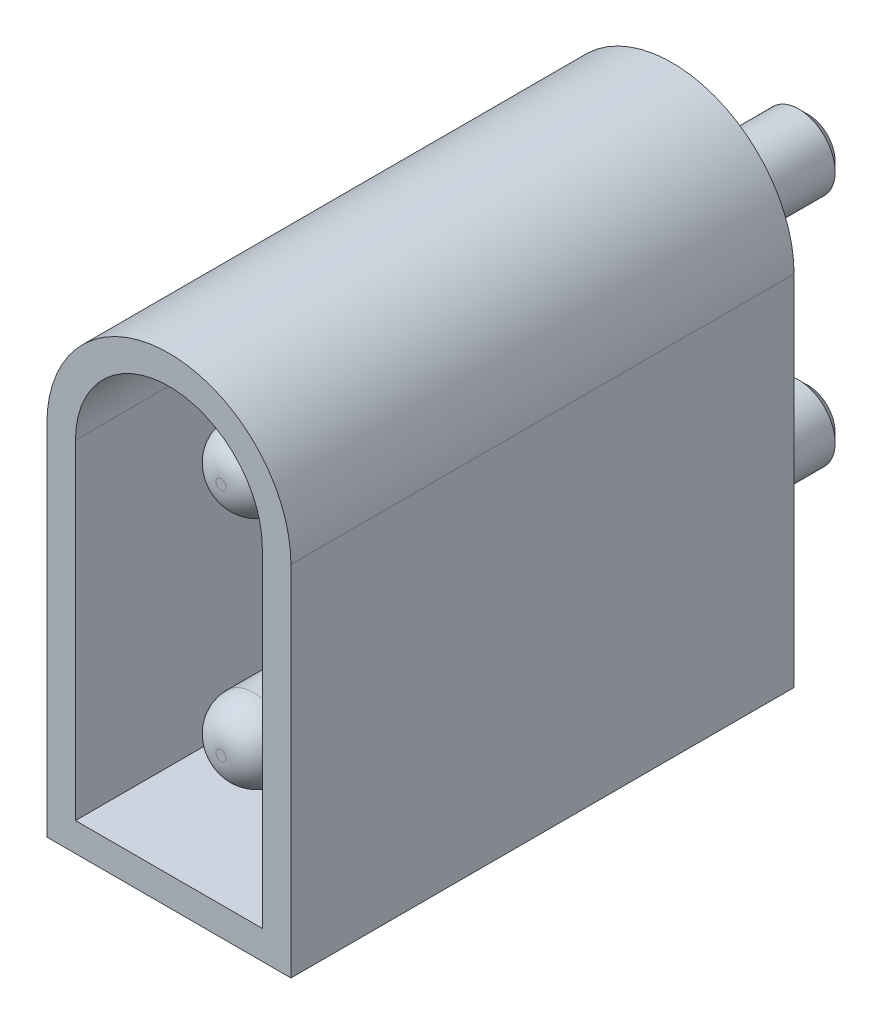
ISO-10303-21;
HEADER;
FILE_DESCRIPTION(('STEP AP214'),'2;1');
FILE_NAME('part.step','',(''),(''),'','','');
FILE_SCHEMA(('AUTOMOTIVE_DESIGN { 1 0 10303 214 1 1 1 1 }'));
ENDSEC;
DATA;
#1=APPLICATION_CONTEXT('core data for automotive mechanical design processes');
#2=APPLICATION_PROTOCOL_DEFINITION('international standard','automotive_design',2000,#1);
#3=PRODUCT_CONTEXT('',#1,'mechanical');
#4=PRODUCT('Part','Part','',(#3));
#5=PRODUCT_RELATED_PRODUCT_CATEGORY('part','',(#4));
#6=PRODUCT_DEFINITION_FORMATION('','',#4);
#7=PRODUCT_DEFINITION_CONTEXT('part definition',#1,'design');
#8=PRODUCT_DEFINITION('design','',#6,#7);
#9=PRODUCT_DEFINITION_SHAPE('','',#8);
#10=(LENGTH_UNIT() NAMED_UNIT(*) SI_UNIT(.MILLI.,.METRE.));
#11=(NAMED_UNIT(*) PLANE_ANGLE_UNIT() SI_UNIT($,.RADIAN.));
#12=(NAMED_UNIT(*) SI_UNIT($,.STERADIAN.) SOLID_ANGLE_UNIT());
#13=UNCERTAINTY_MEASURE_WITH_UNIT(LENGTH_MEASURE(1.E-05),#10,'distance_accuracy_value','');
#14=(GEOMETRIC_REPRESENTATION_CONTEXT(3) GLOBAL_UNCERTAINTY_ASSIGNED_CONTEXT((#13)) GLOBAL_UNIT_ASSIGNED_CONTEXT((#10,
#11,#12)) REPRESENTATION_CONTEXT('',''));
#15=CARTESIAN_POINT('',(0.,0.,0.));
#16=DIRECTION('',(0.,0.,1.));
#17=DIRECTION('',(1.,0.,0.));
#18=AXIS2_PLACEMENT_3D('',#15,#16,#17);
#19=CARTESIAN_POINT('',(0.,7.63,10.72));
#20=DIRECTION('',(0.,0.,-1.));
#21=DIRECTION('',(-1.,0.,0.));
#22=AXIS2_PLACEMENT_3D('',#19,#20,#21);
#23=PLANE('',#22);
#24=CARTESIAN_POINT('',(0.,7.63,10.72));
#25=DIRECTION('',(0.,0.,1.));
#26=DIRECTION('',(-1.,0.,0.));
#27=AXIS2_PLACEMENT_3D('',#24,#25,#26);
#28=CIRCLE('',#27,2.6);
#29=CARTESIAN_POINT('',(2.6,7.63,10.72));
#30=VERTEX_POINT('',#29);
#31=CARTESIAN_POINT('',(-2.6,7.63,10.72));
#32=VERTEX_POINT('',#31);
#33=EDGE_CURVE('E170',#30,#32,#28,.T.);
#34=ORIENTED_EDGE('',*,*,#33,.T.);
#35=DIRECTION('',(0.,-1.,0.));
#36=VECTOR('',#35,1.);
#37=CARTESIAN_POINT('',(-2.6,7.63,10.72));
#38=LINE('',#37,#36);
#39=CARTESIAN_POINT('',(-2.6,0.,10.72));
#40=VERTEX_POINT('',#39);
#41=EDGE_CURVE('E95',#32,#40,#38,.T.);
#42=ORIENTED_EDGE('',*,*,#41,.T.);
#43=DIRECTION('',(1.,0.,0.));
#44=VECTOR('',#43,1.);
#45=CARTESIAN_POINT('',(-2.6,0.,10.72));
#46=LINE('',#45,#44);
#47=CARTESIAN_POINT('',(2.6,0.,10.72));
#48=VERTEX_POINT('',#47);
#49=EDGE_CURVE('E173',#40,#48,#46,.T.);
#50=ORIENTED_EDGE('',*,*,#49,.T.);
#51=DIRECTION('',(0.,1.,0.));
#52=VECTOR('',#51,1.);
#53=CARTESIAN_POINT('',(2.6,0.,10.72));
#54=LINE('',#53,#52);
#55=EDGE_CURVE('E66',#48,#30,#54,.T.);
#56=ORIENTED_EDGE('',*,*,#55,.T.);
#57=EDGE_LOOP('',(#34,#42,#50,#56));
#58=FACE_BOUND('',#57,.T.);
#59=CARTESIAN_POINT('',(0.,7.63,10.72));
#60=DIRECTION('',(0.,0.,-1.));
#61=DIRECTION('',(-1.,0.,0.));
#62=AXIS2_PLACEMENT_3D('',#59,#60,#61);
#63=CIRCLE('',#62,1.99);
#64=CARTESIAN_POINT('',(1.99,7.63,10.72));
#65=VERTEX_POINT('',#64);
#66=CARTESIAN_POINT('',(-1.99,7.63,10.72));
#67=VERTEX_POINT('',#66);
#68=EDGE_CURVE('E140',#65,#67,#63,.F.);
#69=ORIENTED_EDGE('',*,*,#68,.F.);
#70=DIRECTION('',(0.,1.,0.));
#71=VECTOR('',#70,1.);
#72=CARTESIAN_POINT('',(1.99,7.63,10.72));
#73=LINE('',#72,#71);
#74=CARTESIAN_POINT('',(1.99,0.61,10.72));
#75=VERTEX_POINT('',#74);
#76=EDGE_CURVE('E155',#75,#65,#73,.T.);
#77=ORIENTED_EDGE('',*,*,#76,.F.);
#78=DIRECTION('',(1.,0.,0.));
#79=VECTOR('',#78,1.);
#80=CARTESIAN_POINT('',(0.,0.61,10.72));
#81=LINE('',#80,#79);
#82=CARTESIAN_POINT('',(-1.99,0.61,10.72));
#83=VERTEX_POINT('',#82);
#84=EDGE_CURVE('E153',#83,#75,#81,.T.);
#85=ORIENTED_EDGE('',*,*,#84,.F.);
#86=DIRECTION('',(0.,-1.,0.));
#87=VECTOR('',#86,1.);
#88=CARTESIAN_POINT('',(-1.99,7.63,10.72));
#89=LINE('',#88,#87);
#90=EDGE_CURVE('E132',#67,#83,#89,.T.);
#91=ORIENTED_EDGE('',*,*,#90,.F.);
#92=EDGE_LOOP('',(#69,#77,#85,#91));
#93=FACE_BOUND('',#92,.T.);
#94=ADVANCED_FACE('F41',(#58,#93),#23,.F.);
#95=CARTESIAN_POINT('',(0.,7.63,10.72));
#96=DIRECTION('',(0.,0.,-1.));
#97=DIRECTION('',(-1.,0.,0.));
#98=AXIS2_PLACEMENT_3D('',#95,#96,#97);
#99=CYLINDRICAL_SURFACE('',#98,2.6);
#100=CARTESIAN_POINT('',(0.,7.63,0.));
#101=DIRECTION('',(0.,0.,1.));
#102=DIRECTION('',(-1.,0.,0.));
#103=AXIS2_PLACEMENT_3D('',#100,#101,#102);
#104=CIRCLE('',#103,2.6);
#105=CARTESIAN_POINT('',(2.6,7.63,0.));
#106=VERTEX_POINT('',#105);
#107=CARTESIAN_POINT('',(-2.6,7.63,0.));
#108=VERTEX_POINT('',#107);
#109=EDGE_CURVE('E169',#106,#108,#104,.T.);
#110=ORIENTED_EDGE('',*,*,#109,.T.);
#111=DIRECTION('',(0.,0.,-1.));
#112=VECTOR('',#111,1.);
#113=CARTESIAN_POINT('',(-2.6,7.63,10.72));
#114=LINE('',#113,#112);
#115=EDGE_CURVE('E190',#32,#108,#114,.T.);
#116=ORIENTED_EDGE('',*,*,#115,.F.);
#117=ORIENTED_EDGE('',*,*,#33,.F.);
#118=DIRECTION('',(0.,0.,-1.));
#119=VECTOR('',#118,1.);
#120=CARTESIAN_POINT('',(2.6,7.63,10.72));
#121=LINE('',#120,#119);
#122=EDGE_CURVE('E176',#30,#106,#121,.T.);
#123=ORIENTED_EDGE('',*,*,#122,.T.);
#124=EDGE_LOOP('',(#110,#116,#117,#123));
#125=FACE_BOUND('',#124,.T.);
#126=ADVANCED_FACE('F231',(#125),#99,.T.);
#127=CARTESIAN_POINT('',(-2.6,7.63,10.72));
#128=DIRECTION('',(1.,0.,0.));
#129=DIRECTION('',(0.,1.,0.));
#130=AXIS2_PLACEMENT_3D('',#127,#128,#129);
#131=PLANE('',#130);
#132=DIRECTION('',(0.,-1.,0.));
#133=VECTOR('',#132,1.);
#134=CARTESIAN_POINT('',(-2.6,7.63,0.));
#135=LINE('',#134,#133);
#136=CARTESIAN_POINT('',(-2.6,0.,0.));
#137=VERTEX_POINT('',#136);
#138=EDGE_CURVE('E179',#108,#137,#135,.T.);
#139=ORIENTED_EDGE('',*,*,#138,.T.);
#140=DIRECTION('',(0.,0.,-1.));
#141=VECTOR('',#140,1.);
#142=CARTESIAN_POINT('',(-2.6,0.,10.72));
#143=LINE('',#142,#141);
#144=EDGE_CURVE('E187',#40,#137,#143,.T.);
#145=ORIENTED_EDGE('',*,*,#144,.F.);
#146=ORIENTED_EDGE('',*,*,#41,.F.);
#147=ORIENTED_EDGE('',*,*,#115,.T.);
#148=EDGE_LOOP('',(#139,#145,#146,#147));
#149=FACE_BOUND('',#148,.T.);
#150=ADVANCED_FACE('F236',(#149),#131,.F.);
#151=CARTESIAN_POINT('',(-2.6,0.,10.72));
#152=DIRECTION('',(0.,1.,0.));
#153=DIRECTION('',(0.,0.,1.));
#154=AXIS2_PLACEMENT_3D('',#151,#152,#153);
#155=PLANE('',#154);
#156=DIRECTION('',(1.,0.,0.));
#157=VECTOR('',#156,1.);
#158=CARTESIAN_POINT('',(-2.6,0.,0.));
#159=LINE('',#158,#157);
#160=CARTESIAN_POINT('',(2.6,0.,0.));
#161=VERTEX_POINT('',#160);
#162=EDGE_CURVE('E181',#137,#161,#159,.T.);
#163=ORIENTED_EDGE('',*,*,#162,.T.);
#164=DIRECTION('',(0.,0.,-1.));
#165=VECTOR('',#164,1.);
#166=CARTESIAN_POINT('',(2.6,0.,10.72));
#167=LINE('',#166,#165);
#168=EDGE_CURVE('E185',#48,#161,#167,.T.);
#169=ORIENTED_EDGE('',*,*,#168,.F.);
#170=ORIENTED_EDGE('',*,*,#49,.F.);
#171=ORIENTED_EDGE('',*,*,#144,.T.);
#172=EDGE_LOOP('',(#163,#169,#170,#171));
#173=FACE_BOUND('',#172,.T.);
#174=ADVANCED_FACE('F251',(#173),#155,.F.);
#175=CARTESIAN_POINT('',(2.6,0.,10.72));
#176=DIRECTION('',(-1.,0.,0.));
#177=DIRECTION('',(0.,-1.,0.));
#178=AXIS2_PLACEMENT_3D('',#175,#176,#177);
#179=PLANE('',#178);
#180=DIRECTION('',(0.,1.,0.));
#181=VECTOR('',#180,1.);
#182=CARTESIAN_POINT('',(2.6,0.,0.));
#183=LINE('',#182,#181);
#184=EDGE_CURVE('E87',#161,#106,#183,.T.);
#185=ORIENTED_EDGE('',*,*,#184,.T.);
#186=ORIENTED_EDGE('',*,*,#122,.F.);
#187=ORIENTED_EDGE('',*,*,#55,.F.);
#188=ORIENTED_EDGE('',*,*,#168,.T.);
#189=EDGE_LOOP('',(#185,#186,#187,#188));
#190=FACE_BOUND('',#189,.T.);
#191=ADVANCED_FACE('F247',(#190),#179,.F.);
#192=CARTESIAN_POINT('',(0.,7.63,0.));
#193=DIRECTION('',(0.,0.,-1.));
#194=DIRECTION('',(-1.,0.,0.));
#195=AXIS2_PLACEMENT_3D('',#192,#193,#194);
#196=PLANE('',#195);
#197=CARTESIAN_POINT('',(0.,2.25,0.));
#198=DIRECTION('',(0.,0.,-1.));
#199=DIRECTION('',(-1.,0.,0.));
#200=AXIS2_PLACEMENT_3D('',#197,#198,#199);
#201=CIRCLE('',#200,0.775);
#202=CARTESIAN_POINT('',(-0.775,2.25,0.));
#203=VERTEX_POINT('',#202);
#204=EDGE_CURVE('E163',#203,#203,#201,.T.);
#205=ORIENTED_EDGE('',*,*,#204,.F.);
#206=EDGE_LOOP('',(#205));
#207=FACE_BOUND('',#206,.T.);
#208=CARTESIAN_POINT('',(0.,7.25,0.));
#209=DIRECTION('',(0.,0.,-1.));
#210=DIRECTION('',(-1.,0.,0.));
#211=AXIS2_PLACEMENT_3D('',#208,#209,#210);
#212=CIRCLE('',#211,0.775);
#213=CARTESIAN_POINT('',(-0.775,7.25,0.));
#214=VERTEX_POINT('',#213);
#215=EDGE_CURVE('E166',#214,#214,#212,.T.);
#216=ORIENTED_EDGE('',*,*,#215,.F.);
#217=EDGE_LOOP('',(#216));
#218=FACE_BOUND('',#217,.T.);
#219=ORIENTED_EDGE('',*,*,#109,.F.);
#220=ORIENTED_EDGE('',*,*,#184,.F.);
#221=ORIENTED_EDGE('',*,*,#162,.F.);
#222=ORIENTED_EDGE('',*,*,#138,.F.);
#223=EDGE_LOOP('',(#219,#220,#221,#222));
#224=FACE_BOUND('',#223,.T.);
#225=ADVANCED_FACE('F244',(#207,#218,#224),#196,.T.);
#226=CARTESIAN_POINT('',(0.,7.25,-2.9));
#227=DIRECTION('',(0.,0.,1.));
#228=DIRECTION('',(1.,0.,0.));
#229=AXIS2_PLACEMENT_3D('',#226,#227,#228);
#230=CYLINDRICAL_SURFACE('',#229,0.775);
#231=CARTESIAN_POINT('',(0.,7.25,-2.7));
#232=DIRECTION('',(0.,0.,-1.));
#233=DIRECTION('',(-1.,0.,0.));
#234=AXIS2_PLACEMENT_3D('',#231,#232,#233);
#235=CIRCLE('',#234,0.775);
#236=CARTESIAN_POINT('',(-0.775,7.25,-2.7));
#237=VERTEX_POINT('',#236);
#238=EDGE_CURVE('E201',#237,#237,#235,.F.);
#239=ORIENTED_EDGE('',*,*,#238,.T.);
#240=EDGE_LOOP('',(#239));
#241=FACE_BOUND('',#240,.T.);
#242=ORIENTED_EDGE('',*,*,#215,.T.);
#243=EDGE_LOOP('',(#242));
#244=FACE_BOUND('',#243,.T.);
#245=ADVANCED_FACE('F242',(#241,#244),#230,.T.);
#246=CARTESIAN_POINT('',(0.,7.25,-2.9));
#247=DIRECTION('',(0.,0.,-1.));
#248=DIRECTION('',(-1.,0.,0.));
#249=AXIS2_PLACEMENT_3D('',#246,#247,#248);
#250=PLANE('',#249);
#251=CARTESIAN_POINT('',(0.,7.25,-2.9));
#252=DIRECTION('',(0.,0.,-1.));
#253=DIRECTION('',(-1.,0.,0.));
#254=AXIS2_PLACEMENT_3D('',#251,#252,#253);
#255=CIRCLE('',#254,0.575000000000001);
#256=CARTESIAN_POINT('',(-0.575000000000001,7.25,-2.9));
#257=VERTEX_POINT('',#256);
#258=EDGE_CURVE('E198',#257,#257,#255,.T.);
#259=ORIENTED_EDGE('',*,*,#258,.T.);
#260=EDGE_LOOP('',(#259));
#261=FACE_BOUND('',#260,.T.);
#262=ADVANCED_FACE('F281',(#261),#250,.T.);
#263=CARTESIAN_POINT('',(0.,2.25,-2.9));
#264=DIRECTION('',(0.,0.,1.));
#265=DIRECTION('',(1.,0.,0.));
#266=AXIS2_PLACEMENT_3D('',#263,#264,#265);
#267=CYLINDRICAL_SURFACE('',#266,0.775);
#268=CARTESIAN_POINT('',(0.,2.25,-2.7));
#269=DIRECTION('',(0.,0.,-1.));
#270=DIRECTION('',(-1.,0.,0.));
#271=AXIS2_PLACEMENT_3D('',#268,#269,#270);
#272=CIRCLE('',#271,0.775);
#273=CARTESIAN_POINT('',(-0.775,2.25,-2.7));
#274=VERTEX_POINT('',#273);
#275=EDGE_CURVE('E195',#274,#274,#272,.F.);
#276=ORIENTED_EDGE('',*,*,#275,.T.);
#277=EDGE_LOOP('',(#276));
#278=FACE_BOUND('',#277,.T.);
#279=ORIENTED_EDGE('',*,*,#204,.T.);
#280=EDGE_LOOP('',(#279));
#281=FACE_BOUND('',#280,.T.);
#282=ADVANCED_FACE('F283',(#278,#281),#267,.T.);
#283=CARTESIAN_POINT('',(0.,2.25,-2.9));
#284=DIRECTION('',(0.,0.,-1.));
#285=DIRECTION('',(-1.,0.,0.));
#286=AXIS2_PLACEMENT_3D('',#283,#284,#285);
#287=PLANE('',#286);
#288=CARTESIAN_POINT('',(0.,2.25,-2.9));
#289=DIRECTION('',(0.,0.,-1.));
#290=DIRECTION('',(-1.,0.,0.));
#291=AXIS2_PLACEMENT_3D('',#288,#289,#290);
#292=CIRCLE('',#291,0.575000000000001);
#293=CARTESIAN_POINT('',(-0.575000000000001,2.25,-2.9));
#294=VERTEX_POINT('',#293);
#295=EDGE_CURVE('E192',#294,#294,#292,.T.);
#296=ORIENTED_EDGE('',*,*,#295,.T.);
#297=EDGE_LOOP('',(#296));
#298=FACE_BOUND('',#297,.T.);
#299=ADVANCED_FACE('F265',(#298),#287,.T.);
#300=CARTESIAN_POINT('',(0.,2.25,-2.9));
#301=DIRECTION('',(0.,0.,1.));
#302=DIRECTION('',(1.,0.,0.));
#303=AXIS2_PLACEMENT_3D('',#300,#301,#302);
#304=CONICAL_SURFACE('',#303,0.575000000000001,0.785398163397443);
#305=ORIENTED_EDGE('',*,*,#275,.F.);
#306=EDGE_LOOP('',(#305));
#307=FACE_BOUND('',#306,.T.);
#308=ORIENTED_EDGE('',*,*,#295,.F.);
#309=EDGE_LOOP('',(#308));
#310=FACE_BOUND('',#309,.T.);
#311=ADVANCED_FACE('F258',(#307,#310),#304,.T.);
#312=CARTESIAN_POINT('',(0.,7.25,-2.9));
#313=DIRECTION('',(0.,0.,1.));
#314=DIRECTION('',(1.,0.,0.));
#315=AXIS2_PLACEMENT_3D('',#312,#313,#314);
#316=CONICAL_SURFACE('',#315,0.575000000000001,0.785398163397442);
#317=ORIENTED_EDGE('',*,*,#238,.F.);
#318=EDGE_LOOP('',(#317));
#319=FACE_BOUND('',#318,.T.);
#320=ORIENTED_EDGE('',*,*,#258,.F.);
#321=EDGE_LOOP('',(#320));
#322=FACE_BOUND('',#321,.T.);
#323=ADVANCED_FACE('F264',(#319,#322),#316,.T.);
#324=CARTESIAN_POINT('',(0.,7.63,10.72));
#325=DIRECTION('',(0.,0.,-1.));
#326=DIRECTION('',(-1.,0.,0.));
#327=AXIS2_PLACEMENT_3D('',#324,#325,#326);
#328=CYLINDRICAL_SURFACE('',#327,1.99);
#329=CARTESIAN_POINT('',(0.,7.63,0.609999999999999));
#330=DIRECTION('',(0.,0.,-1.));
#331=DIRECTION('',(-1.,0.,0.));
#332=AXIS2_PLACEMENT_3D('',#329,#330,#331);
#333=CIRCLE('',#332,1.99);
#334=CARTESIAN_POINT('',(1.99,7.63,0.609999999999999));
#335=VERTEX_POINT('',#334);
#336=CARTESIAN_POINT('',(-1.99,7.63,0.609999999999999));
#337=VERTEX_POINT('',#336);
#338=EDGE_CURVE('E123',#335,#337,#333,.F.);
#339=ORIENTED_EDGE('',*,*,#338,.F.);
#340=DIRECTION('',(0.,0.,-1.));
#341=VECTOR('',#340,1.);
#342=CARTESIAN_POINT('',(1.99,7.63,10.72));
#343=LINE('',#342,#341);
#344=EDGE_CURVE('E143',#65,#335,#343,.T.);
#345=ORIENTED_EDGE('',*,*,#344,.F.);
#346=ORIENTED_EDGE('',*,*,#68,.T.);
#347=DIRECTION('',(0.,0.,1.));
#348=VECTOR('',#347,1.);
#349=CARTESIAN_POINT('',(-1.99,7.63,10.72));
#350=LINE('',#349,#348);
#351=EDGE_CURVE('E135',#67,#337,#350,.F.);
#352=ORIENTED_EDGE('',*,*,#351,.T.);
#353=EDGE_LOOP('',(#339,#345,#346,#352));
#354=FACE_BOUND('',#353,.T.);
#355=ADVANCED_FACE('F270',(#354),#328,.F.);
#356=CARTESIAN_POINT('',(-1.99,7.63,10.72));
#357=DIRECTION('',(1.,0.,0.));
#358=DIRECTION('',(0.,1.,0.));
#359=AXIS2_PLACEMENT_3D('',#356,#357,#358);
#360=PLANE('',#359);
#361=DIRECTION('',(0.,-1.,0.));
#362=VECTOR('',#361,1.);
#363=CARTESIAN_POINT('',(-1.99,7.63,0.61));
#364=LINE('',#363,#362);
#365=CARTESIAN_POINT('',(-1.99,0.61,0.61));
#366=VERTEX_POINT('',#365);
#367=EDGE_CURVE('E117',#337,#366,#364,.T.);
#368=ORIENTED_EDGE('',*,*,#367,.F.);
#369=ORIENTED_EDGE('',*,*,#351,.F.);
#370=ORIENTED_EDGE('',*,*,#90,.T.);
#371=DIRECTION('',(0.,0.,-1.));
#372=VECTOR('',#371,1.);
#373=CARTESIAN_POINT('',(-1.99,0.61,10.72));
#374=LINE('',#373,#372);
#375=EDGE_CURVE('E129',#83,#366,#374,.T.);
#376=ORIENTED_EDGE('',*,*,#375,.T.);
#377=EDGE_LOOP('',(#368,#369,#370,#376));
#378=FACE_BOUND('',#377,.T.);
#379=ADVANCED_FACE('F130',(#378),#360,.T.);
#380=CARTESIAN_POINT('',(-2.6,0.61,10.72));
#381=DIRECTION('',(0.,1.,0.));
#382=DIRECTION('',(0.,0.,1.));
#383=AXIS2_PLACEMENT_3D('',#380,#381,#382);
#384=PLANE('',#383);
#385=DIRECTION('',(1.,0.,0.));
#386=VECTOR('',#385,1.);
#387=CARTESIAN_POINT('',(0.,0.61,0.61));
#388=LINE('',#387,#386);
#389=CARTESIAN_POINT('',(1.99,0.61,0.61));
#390=VERTEX_POINT('',#389);
#391=EDGE_CURVE('E121',#366,#390,#388,.T.);
#392=ORIENTED_EDGE('',*,*,#391,.F.);
#393=ORIENTED_EDGE('',*,*,#375,.F.);
#394=ORIENTED_EDGE('',*,*,#84,.T.);
#395=DIRECTION('',(0.,0.,-1.));
#396=VECTOR('',#395,1.);
#397=CARTESIAN_POINT('',(1.99,0.61,10.72));
#398=LINE('',#397,#396);
#399=EDGE_CURVE('E57',#75,#390,#398,.T.);
#400=ORIENTED_EDGE('',*,*,#399,.T.);
#401=EDGE_LOOP('',(#392,#393,#394,#400));
#402=FACE_BOUND('',#401,.T.);
#403=ADVANCED_FACE('F137',(#402),#384,.T.);
#404=CARTESIAN_POINT('',(1.99,0.,10.72));
#405=DIRECTION('',(-1.,0.,0.));
#406=DIRECTION('',(0.,-1.,0.));
#407=AXIS2_PLACEMENT_3D('',#404,#405,#406);
#408=PLANE('',#407);
#409=DIRECTION('',(0.,1.,0.));
#410=VECTOR('',#409,1.);
#411=CARTESIAN_POINT('',(1.99,7.63,0.61));
#412=LINE('',#411,#410);
#413=EDGE_CURVE('E138',#390,#335,#412,.T.);
#414=ORIENTED_EDGE('',*,*,#413,.F.);
#415=ORIENTED_EDGE('',*,*,#399,.F.);
#416=ORIENTED_EDGE('',*,*,#76,.T.);
#417=ORIENTED_EDGE('',*,*,#344,.T.);
#418=EDGE_LOOP('',(#414,#415,#416,#417));
#419=FACE_BOUND('',#418,.T.);
#420=ADVANCED_FACE('F319',(#419),#408,.T.);
#421=CARTESIAN_POINT('',(0.,7.63,0.61));
#422=DIRECTION('',(0.,0.,-1.));
#423=DIRECTION('',(-1.,0.,0.));
#424=AXIS2_PLACEMENT_3D('',#421,#422,#423);
#425=PLANE('',#424);
#426=CARTESIAN_POINT('',(0.,7.25,0.609999999999999));
#427=DIRECTION('',(0.,0.,-1.));
#428=DIRECTION('',(-1.,0.,0.));
#429=AXIS2_PLACEMENT_3D('',#426,#427,#428);
#430=CIRCLE('',#429,0.81);
#431=CARTESIAN_POINT('',(-0.81,7.25,0.609999999999999));
#432=VERTEX_POINT('',#431);
#433=EDGE_CURVE('E207',#432,#432,#430,.F.);
#434=ORIENTED_EDGE('',*,*,#433,.F.);
#435=EDGE_LOOP('',(#434));
#436=FACE_BOUND('',#435,.T.);
#437=CARTESIAN_POINT('',(0.,2.25,0.609999999999999));
#438=DIRECTION('',(0.,0.,-1.));
#439=DIRECTION('',(-1.,0.,0.));
#440=AXIS2_PLACEMENT_3D('',#437,#438,#439);
#441=CIRCLE('',#440,0.81);
#442=CARTESIAN_POINT('',(-0.81,2.25,0.609999999999999));
#443=VERTEX_POINT('',#442);
#444=EDGE_CURVE('E204',#443,#443,#441,.F.);
#445=ORIENTED_EDGE('',*,*,#444,.F.);
#446=EDGE_LOOP('',(#445));
#447=FACE_BOUND('',#446,.T.);
#448=ORIENTED_EDGE('',*,*,#338,.T.);
#449=ORIENTED_EDGE('',*,*,#367,.T.);
#450=ORIENTED_EDGE('',*,*,#391,.T.);
#451=ORIENTED_EDGE('',*,*,#413,.T.);
#452=EDGE_LOOP('',(#448,#449,#450,#451));
#453=FACE_BOUND('',#452,.T.);
#454=ADVANCED_FACE('F119',(#436,#447,#453),#425,.F.);
#455=CARTESIAN_POINT('',(0.,2.25,9.61));
#456=DIRECTION('',(0.,0.,-1.));
#457=DIRECTION('',(-1.,0.,0.));
#458=AXIS2_PLACEMENT_3D('',#455,#456,#457);
#459=CYLINDRICAL_SURFACE('',#458,0.81);
#460=CARTESIAN_POINT('',(0.,2.25,8.91));
#461=DIRECTION('',(0.,0.,1.));
#462=DIRECTION('',(1.,0.,0.));
#463=AXIS2_PLACEMENT_3D('',#460,#461,#462);
#464=CIRCLE('',#463,0.81);
#465=CARTESIAN_POINT('',(0.81,2.25,8.91));
#466=VERTEX_POINT('',#465);
#467=EDGE_CURVE('E11',#466,#466,#464,.F.);
#468=ORIENTED_EDGE('',*,*,#467,.T.);
#469=EDGE_LOOP('',(#468));
#470=FACE_BOUND('',#469,.T.);
#471=ORIENTED_EDGE('',*,*,#444,.T.);
#472=EDGE_LOOP('',(#471));
#473=FACE_BOUND('',#472,.T.);
#474=ADVANCED_FACE('F318',(#470,#473),#459,.T.);
#475=CARTESIAN_POINT('',(0.,2.25,9.61));
#476=DIRECTION('',(0.,0.,1.));
#477=DIRECTION('',(1.,0.,0.));
#478=AXIS2_PLACEMENT_3D('',#475,#476,#477);
#479=PLANE('',#478);
#480=CARTESIAN_POINT('',(0.,2.25,9.61));
#481=DIRECTION('',(0.,0.,1.));
#482=DIRECTION('',(1.,0.,0.));
#483=AXIS2_PLACEMENT_3D('',#480,#481,#482);
#484=CIRCLE('',#483,0.11);
#485=CARTESIAN_POINT('',(0.11,2.25,9.61));
#486=VERTEX_POINT('',#485);
#487=EDGE_CURVE('E50',#486,#486,#484,.T.);
#488=ORIENTED_EDGE('',*,*,#487,.T.);
#489=EDGE_LOOP('',(#488));
#490=FACE_BOUND('',#489,.T.);
#491=ADVANCED_FACE('F218',(#490),#479,.T.);
#492=CARTESIAN_POINT('',(0.,7.25,9.61));
#493=DIRECTION('',(0.,0.,-1.));
#494=DIRECTION('',(-1.,0.,0.));
#495=AXIS2_PLACEMENT_3D('',#492,#493,#494);
#496=CYLINDRICAL_SURFACE('',#495,0.81);
#497=CARTESIAN_POINT('',(0.,7.25,8.91));
#498=DIRECTION('',(0.,0.,1.));
#499=DIRECTION('',(1.,0.,0.));
#500=AXIS2_PLACEMENT_3D('',#497,#498,#499);
#501=CIRCLE('',#500,0.81);
#502=CARTESIAN_POINT('',(0.81,7.25,8.91));
#503=VERTEX_POINT('',#502);
#504=EDGE_CURVE('E213',#503,#503,#501,.F.);
#505=ORIENTED_EDGE('',*,*,#504,.T.);
#506=EDGE_LOOP('',(#505));
#507=FACE_BOUND('',#506,.T.);
#508=ORIENTED_EDGE('',*,*,#433,.T.);
#509=EDGE_LOOP('',(#508));
#510=FACE_BOUND('',#509,.T.);
#511=ADVANCED_FACE('F335',(#507,#510),#496,.T.);
#512=CARTESIAN_POINT('',(0.,7.25,9.61));
#513=DIRECTION('',(0.,0.,1.));
#514=DIRECTION('',(1.,0.,0.));
#515=AXIS2_PLACEMENT_3D('',#512,#513,#514);
#516=PLANE('',#515);
#517=CARTESIAN_POINT('',(0.,7.25,9.61));
#518=DIRECTION('',(0.,0.,1.));
#519=DIRECTION('',(1.,0.,0.));
#520=AXIS2_PLACEMENT_3D('',#517,#518,#519);
#521=CIRCLE('',#520,0.11);
#522=CARTESIAN_POINT('',(0.11,7.25,9.61));
#523=VERTEX_POINT('',#522);
#524=EDGE_CURVE('E210',#523,#523,#521,.T.);
#525=ORIENTED_EDGE('',*,*,#524,.T.);
#526=EDGE_LOOP('',(#525));
#527=FACE_BOUND('',#526,.T.);
#528=ADVANCED_FACE('F227',(#527),#516,.T.);
#529=CARTESIAN_POINT('',(0.,7.25,8.91));
#530=DIRECTION('',(0.,0.,1.));
#531=DIRECTION('',(1.,0.,0.));
#532=AXIS2_PLACEMENT_3D('',#529,#530,#531);
#533=DEGENERATE_TOROIDAL_SURFACE('',#532,0.11,0.7,.T.);
#534=ORIENTED_EDGE('',*,*,#504,.F.);
#535=EDGE_LOOP('',(#534));
#536=FACE_BOUND('',#535,.T.);
#537=ORIENTED_EDGE('',*,*,#524,.F.);
#538=EDGE_LOOP('',(#537));
#539=FACE_BOUND('',#538,.T.);
#540=ADVANCED_FACE('F221',(#536,#539),#533,.T.);
#541=CARTESIAN_POINT('',(0.,2.25,8.91));
#542=DIRECTION('',(0.,0.,1.));
#543=DIRECTION('',(1.,0.,0.));
#544=AXIS2_PLACEMENT_3D('',#541,#542,#543);
#545=DEGENERATE_TOROIDAL_SURFACE('',#544,0.11,0.7,.T.);
#546=ORIENTED_EDGE('',*,*,#467,.F.);
#547=EDGE_LOOP('',(#546));
#548=FACE_BOUND('',#547,.T.);
#549=ORIENTED_EDGE('',*,*,#487,.F.);
#550=EDGE_LOOP('',(#549));
#551=FACE_BOUND('',#550,.T.);
#552=ADVANCED_FACE('F43',(#548,#551),#545,.T.);
#553=CLOSED_SHELL('',(#94,#126,#150,#174,#191,#225,#245,#262,#282,#299,#311,#323,#355,#379,#403,
#420,#454,#474,#491,#511,#528,#540,#552));
#554=CARTESIAN_POINT('',(0.,7.25,0.61));
#555=DIRECTION('',(0.,0.,1.));
#556=DIRECTION('',(1.,0.,0.));
#557=AXIS2_PLACEMENT_3D('',#554,#555,#556);
#558=PLANE('',#557);
#559=CARTESIAN_POINT('',(0.,7.25,0.61));
#560=DIRECTION('',(0.,0.,-1.));
#561=DIRECTION('',(-1.,0.,0.));
#562=AXIS2_PLACEMENT_3D('',#559,#560,#561);
#563=CIRCLE('',#562,0.165);
#564=CARTESIAN_POINT('',(-0.165,7.25,0.61));
#565=VERTEX_POINT('',#564);
#566=EDGE_CURVE('E148',#565,#565,#563,.T.);
#567=ORIENTED_EDGE('',*,*,#566,.T.);
#568=EDGE_LOOP('',(#567));
#569=FACE_BOUND('',#568,.T.);
#570=ADVANCED_FACE('F310',(#569),#558,.F.);
#571=CARTESIAN_POINT('',(0.,7.25,-2.29));
#572=DIRECTION('',(0.,0.,-1.));
#573=DIRECTION('',(-1.,0.,0.));
#574=AXIS2_PLACEMENT_3D('',#571,#572,#573);
#575=PLANE('',#574);
#576=CARTESIAN_POINT('',(0.,7.25,-2.29));
#577=DIRECTION('',(0.,0.,-1.));
#578=DIRECTION('',(-1.,0.,0.));
#579=AXIS2_PLACEMENT_3D('',#576,#577,#578);
#580=CIRCLE('',#579,0.165);
#581=CARTESIAN_POINT('',(-0.165,7.25,-2.29));
#582=VERTEX_POINT('',#581);
#583=EDGE_CURVE('E157',#582,#582,#580,.T.);
#584=ORIENTED_EDGE('',*,*,#583,.F.);
#585=EDGE_LOOP('',(#584));
#586=FACE_BOUND('',#585,.T.);
#587=ADVANCED_FACE('F306',(#586),#575,.F.);
#588=CARTESIAN_POINT('',(0.,7.25,-2.9));
#589=DIRECTION('',(0.,0.,1.));
#590=DIRECTION('',(1.,0.,0.));
#591=AXIS2_PLACEMENT_3D('',#588,#589,#590);
#592=CYLINDRICAL_SURFACE('',#591,0.165);
#593=ORIENTED_EDGE('',*,*,#583,.T.);
#594=EDGE_LOOP('',(#593));
#595=FACE_BOUND('',#594,.T.);
#596=ORIENTED_EDGE('',*,*,#566,.F.);
#597=EDGE_LOOP('',(#596));
#598=FACE_BOUND('',#597,.T.);
#599=ADVANCED_FACE('F309',(#595,#598),#592,.F.);
#600=CLOSED_SHELL('',(#570,#587,#599));
#601=CARTESIAN_POINT('',(0.,2.25,0.61));
#602=DIRECTION('',(0.,0.,1.));
#603=DIRECTION('',(1.,0.,0.));
#604=AXIS2_PLACEMENT_3D('',#601,#602,#603);
#605=PLANE('',#604);
#606=CARTESIAN_POINT('',(0.,2.25,0.61));
#607=DIRECTION('',(0.,0.,-1.));
#608=DIRECTION('',(-1.,0.,0.));
#609=AXIS2_PLACEMENT_3D('',#606,#607,#608);
#610=CIRCLE('',#609,0.165);
#611=CARTESIAN_POINT('',(-0.165,2.25,0.61));
#612=VERTEX_POINT('',#611);
#613=EDGE_CURVE('E145',#612,#612,#610,.T.);
#614=ORIENTED_EDGE('',*,*,#613,.T.);
#615=EDGE_LOOP('',(#614));
#616=FACE_BOUND('',#615,.T.);
#617=ADVANCED_FACE('F299',(#616),#605,.F.);
#618=CARTESIAN_POINT('',(0.,2.25,-2.29));
#619=DIRECTION('',(0.,0.,-1.));
#620=DIRECTION('',(-1.,0.,0.));
#621=AXIS2_PLACEMENT_3D('',#618,#619,#620);
#622=PLANE('',#621);
#623=CARTESIAN_POINT('',(0.,2.25,-2.29));
#624=DIRECTION('',(0.,0.,-1.));
#625=DIRECTION('',(-1.,0.,0.));
#626=AXIS2_PLACEMENT_3D('',#623,#624,#625);
#627=CIRCLE('',#626,0.165);
#628=CARTESIAN_POINT('',(-0.165,2.25,-2.29));
#629=VERTEX_POINT('',#628);
#630=EDGE_CURVE('E160',#629,#629,#627,.T.);
#631=ORIENTED_EDGE('',*,*,#630,.F.);
#632=EDGE_LOOP('',(#631));
#633=FACE_BOUND('',#632,.T.);
#634=ADVANCED_FACE('F295',(#633),#622,.F.);
#635=CARTESIAN_POINT('',(0.,2.25,-2.9));
#636=DIRECTION('',(0.,0.,1.));
#637=DIRECTION('',(1.,0.,0.));
#638=AXIS2_PLACEMENT_3D('',#635,#636,#637);
#639=CYLINDRICAL_SURFACE('',#638,0.165);
#640=ORIENTED_EDGE('',*,*,#630,.T.);
#641=EDGE_LOOP('',(#640));
#642=FACE_BOUND('',#641,.T.);
#643=ORIENTED_EDGE('',*,*,#613,.F.);
#644=EDGE_LOOP('',(#643));
#645=FACE_BOUND('',#644,.T.);
#646=ADVANCED_FACE('F298',(#642,#645),#639,.F.);
#647=CLOSED_SHELL('',(#617,#634,#646));
#648=ORIENTED_CLOSED_SHELL('',*,#600,.T.);
#649=ORIENTED_CLOSED_SHELL('',*,#647,.T.);
#650=BREP_WITH_VOIDS('B2',#553,(#648,#649));
#651=ADVANCED_BREP_SHAPE_REPRESENTATION('',(#18,#650),#14);
#652=SHAPE_DEFINITION_REPRESENTATION(#9,#651);
ENDSEC;
END-ISO-10303-21;
